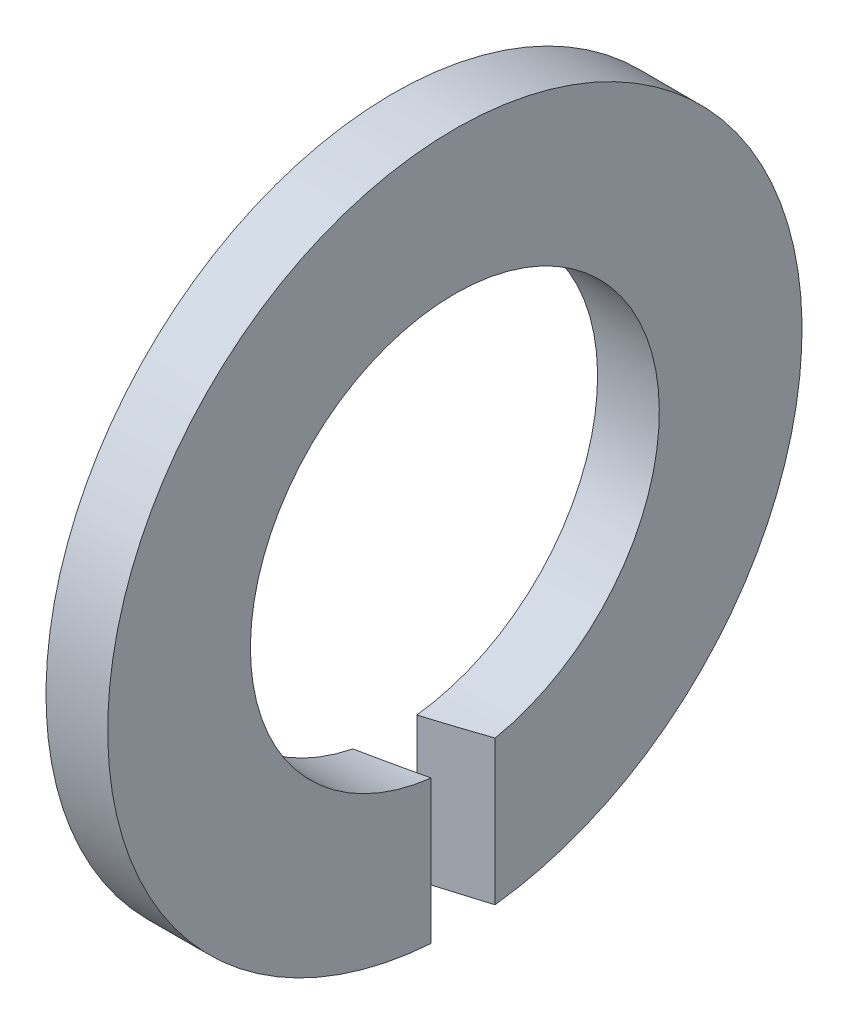
ISO-10303-21;
HEADER;
FILE_DESCRIPTION(('STEP AP214'),'2;1');
FILE_NAME('part.step','',(''),(''),'','','');
FILE_SCHEMA(('AUTOMOTIVE_DESIGN { 1 0 10303 214 1 1 1 1 }'));
ENDSEC;
DATA;
#1=APPLICATION_CONTEXT('core data for automotive mechanical design processes');
#2=APPLICATION_PROTOCOL_DEFINITION('international standard','automotive_design',2000,#1);
#3=PRODUCT_CONTEXT('',#1,'mechanical');
#4=PRODUCT('Part','Part','',(#3));
#5=PRODUCT_RELATED_PRODUCT_CATEGORY('part','',(#4));
#6=PRODUCT_DEFINITION_FORMATION('','',#4);
#7=PRODUCT_DEFINITION_CONTEXT('part definition',#1,'design');
#8=PRODUCT_DEFINITION('design','',#6,#7);
#9=PRODUCT_DEFINITION_SHAPE('','',#8);
#10=(LENGTH_UNIT() NAMED_UNIT(*) SI_UNIT(.MILLI.,.METRE.));
#11=(NAMED_UNIT(*) PLANE_ANGLE_UNIT() SI_UNIT($,.RADIAN.));
#12=(NAMED_UNIT(*) SI_UNIT($,.STERADIAN.) SOLID_ANGLE_UNIT());
#13=UNCERTAINTY_MEASURE_WITH_UNIT(LENGTH_MEASURE(1.E-05),#10,'distance_accuracy_value','');
#14=(GEOMETRIC_REPRESENTATION_CONTEXT(3) GLOBAL_UNCERTAINTY_ASSIGNED_CONTEXT((#13)) GLOBAL_UNIT_ASSIGNED_CONTEXT((#10,
#11,#12)) REPRESENTATION_CONTEXT('',''));
#15=CARTESIAN_POINT('',(0.,0.,0.));
#16=DIRECTION('',(0.,0.,1.));
#17=DIRECTION('',(1.,0.,0.));
#18=AXIS2_PLACEMENT_3D('',#15,#16,#17);
#19=CARTESIAN_POINT('',(-34.9249999999999,0.,0.));
#20=DIRECTION('',(-1.,0.,0.));
#21=DIRECTION('',(0.,0.,1.));
#22=AXIS2_PLACEMENT_3D('',#19,#20,#21);
#23=CYLINDRICAL_SURFACE('',#22,2.65);
#24=CARTESIAN_POINT('',(-0.800000000000002,0.,0.));
#25=DIRECTION('',(-1.,0.,0.));
#26=DIRECTION('',(0.,0.,1.));
#27=AXIS2_PLACEMENT_3D('',#24,#25,#26);
#28=CIRCLE('',#27,2.65);
#29=CARTESIAN_POINT('',(-0.800000000000002,-2.59822181124192,0.521290149136479));
#30=VERTEX_POINT('',#29);
#31=CARTESIAN_POINT('',(-0.800000000000002,-2.63216517091216,-0.306930795191587));
#32=VERTEX_POINT('',#31);
#33=EDGE_CURVE('E81',#30,#32,#28,.T.);
#34=ORIENTED_EDGE('',*,*,#33,.T.);
#35=CARTESIAN_POINT('',(-1.94548132206255,0.,0.));
#36=DIRECTION('',(-0.258819045102515,0.,-0.96592582628907));
#37=DIRECTION('',(-0.96592582628907,0.,0.258819045102515));
#38=AXIS2_PLACEMENT_3D('',#35,#36,#37);
#39=ELLIPSE('',#38,10.2388137586644,2.65);
#40=CARTESIAN_POINT('',(0.,-2.59822181124192,-0.521290149136479));
#41=VERTEX_POINT('',#40);
#42=EDGE_CURVE('E55',#32,#41,#39,.F.);
#43=ORIENTED_EDGE('',*,*,#42,.T.);
#44=CARTESIAN_POINT('',(0.,0.,0.));
#45=DIRECTION('',(-1.,0.,0.));
#46=DIRECTION('',(0.,0.,1.));
#47=AXIS2_PLACEMENT_3D('',#44,#45,#46);
#48=CIRCLE('',#47,2.65);
#49=CARTESIAN_POINT('',(0.,-2.63216517091216,0.306930795191586));
#50=VERTEX_POINT('',#49);
#51=EDGE_CURVE('E77',#50,#41,#48,.T.);
#52=ORIENTED_EDGE('',*,*,#51,.F.);
#53=CARTESIAN_POINT('',(1.14548132206254,0.,0.));
#54=DIRECTION('',(0.258819045102515,0.,0.96592582628907));
#55=DIRECTION('',(-0.96592582628907,0.,0.258819045102515));
#56=AXIS2_PLACEMENT_3D('',#53,#54,#55);
#57=ELLIPSE('',#56,10.2388137586644,2.65);
#58=EDGE_CURVE('E71',#50,#30,#57,.F.);
#59=ORIENTED_EDGE('',*,*,#58,.T.);
#60=EDGE_LOOP('',(#34,#43,#52,#59));
#61=FACE_BOUND('',#60,.T.);
#62=ADVANCED_FACE('F33',(#61),#23,.F.);
#63=CARTESIAN_POINT('',(0.,2.65,0.));
#64=DIRECTION('',(-1.,0.,0.));
#65=DIRECTION('',(0.,0.,1.));
#66=AXIS2_PLACEMENT_3D('',#63,#64,#65);
#67=PLANE('',#66);
#68=ORIENTED_EDGE('',*,*,#51,.T.);
#69=DIRECTION('',(0.,1.,0.));
#70=VECTOR('',#69,1.);
#71=CARTESIAN_POINT('',(0.,-10.,-0.521290149136479));
#72=LINE('',#71,#70);
#73=CARTESIAN_POINT('',(0.,-4.46970430570225,-0.521290149136479));
#74=VERTEX_POINT('',#73);
#75=EDGE_CURVE('E100',#74,#41,#72,.T.);
#76=ORIENTED_EDGE('',*,*,#75,.F.);
#77=CARTESIAN_POINT('',(0.,0.,0.));
#78=DIRECTION('',(-1.,0.,0.));
#79=DIRECTION('',(0.,0.,1.));
#80=AXIS2_PLACEMENT_3D('',#77,#78,#79);
#81=CIRCLE('',#80,4.5);
#82=CARTESIAN_POINT('',(0.,-4.48952040723317,0.306930795191585));
#83=VERTEX_POINT('',#82);
#84=EDGE_CURVE('E89',#83,#74,#81,.T.);
#85=ORIENTED_EDGE('',*,*,#84,.F.);
#86=DIRECTION('',(0.,1.,0.));
#87=VECTOR('',#86,1.);
#88=CARTESIAN_POINT('',(0.,2.65,0.306930795191586));
#89=LINE('',#88,#87);
#90=EDGE_CURVE('E84',#83,#50,#89,.T.);
#91=ORIENTED_EDGE('',*,*,#90,.T.);
#92=EDGE_LOOP('',(#68,#76,#85,#91));
#93=FACE_BOUND('',#92,.T.);
#94=ADVANCED_FACE('F98',(#93),#67,.F.);
#95=CARTESIAN_POINT('',(-34.9249999999999,0.,0.));
#96=DIRECTION('',(-1.,0.,0.));
#97=DIRECTION('',(0.,0.,1.));
#98=AXIS2_PLACEMENT_3D('',#95,#96,#97);
#99=CYLINDRICAL_SURFACE('',#98,4.5);
#100=ORIENTED_EDGE('',*,*,#84,.T.);
#101=CARTESIAN_POINT('',(-1.94548132206255,0.,0.));
#102=DIRECTION('',(-0.258819045102515,0.,-0.96592582628907));
#103=DIRECTION('',(-0.96592582628907,0.,0.258819045102515));
#104=AXIS2_PLACEMENT_3D('',#101,#102,#103);
#105=ELLIPSE('',#104,17.3866648732036,4.5);
#106=CARTESIAN_POINT('',(-0.800000000000002,-4.48952040723317,-0.306930795191587));
#107=VERTEX_POINT('',#106);
#108=EDGE_CURVE('E83',#74,#107,#105,.T.);
#109=ORIENTED_EDGE('',*,*,#108,.T.);
#110=CARTESIAN_POINT('',(-0.800000000000002,0.,0.));
#111=DIRECTION('',(-1.,0.,0.));
#112=DIRECTION('',(0.,0.,1.));
#113=AXIS2_PLACEMENT_3D('',#110,#111,#112);
#114=CIRCLE('',#113,4.5);
#115=CARTESIAN_POINT('',(-0.800000000000002,-4.46970430570225,0.521290149136479));
#116=VERTEX_POINT('',#115);
#117=EDGE_CURVE('E87',#116,#107,#114,.T.);
#118=ORIENTED_EDGE('',*,*,#117,.F.);
#119=CARTESIAN_POINT('',(1.14548132206254,0.,0.));
#120=DIRECTION('',(0.258819045102515,0.,0.96592582628907));
#121=DIRECTION('',(-0.96592582628907,0.,0.258819045102515));
#122=AXIS2_PLACEMENT_3D('',#119,#120,#121);
#123=ELLIPSE('',#122,17.3866648732036,4.5);
#124=EDGE_CURVE('E47',#116,#83,#123,.T.);
#125=ORIENTED_EDGE('',*,*,#124,.T.);
#126=EDGE_LOOP('',(#100,#109,#118,#125));
#127=FACE_BOUND('',#126,.T.);
#128=ADVANCED_FACE('F106',(#127),#99,.T.);
#129=CARTESIAN_POINT('',(-0.800000000000001,4.5,0.));
#130=DIRECTION('',(1.,0.,0.));
#131=DIRECTION('',(0.,0.,-1.));
#132=AXIS2_PLACEMENT_3D('',#129,#130,#131);
#133=PLANE('',#132);
#134=ORIENTED_EDGE('',*,*,#117,.T.);
#135=DIRECTION('',(0.,1.,0.));
#136=VECTOR('',#135,1.);
#137=CARTESIAN_POINT('',(-0.800000000000001,4.5,-0.306930795191587));
#138=LINE('',#137,#136);
#139=EDGE_CURVE('E11',#107,#32,#138,.T.);
#140=ORIENTED_EDGE('',*,*,#139,.T.);
#141=ORIENTED_EDGE('',*,*,#33,.F.);
#142=DIRECTION('',(0.,-1.,0.));
#143=VECTOR('',#142,1.);
#144=CARTESIAN_POINT('',(-0.800000000000001,4.5,0.521290149136479));
#145=LINE('',#144,#143);
#146=EDGE_CURVE('E40',#30,#116,#145,.T.);
#147=ORIENTED_EDGE('',*,*,#146,.T.);
#148=EDGE_LOOP('',(#134,#140,#141,#147));
#149=FACE_BOUND('',#148,.T.);
#150=ADVANCED_FACE('F86',(#149),#133,.F.);
#151=CARTESIAN_POINT('',(-0.800000000000002,-10.,0.521290149136479));
#152=DIRECTION('',(0.258819045102515,0.,0.96592582628907));
#153=DIRECTION('',(0.96592582628907,0.,-0.258819045102515));
#154=AXIS2_PLACEMENT_3D('',#151,#152,#153);
#155=PLANE('',#154);
#156=ORIENTED_EDGE('',*,*,#90,.F.);
#157=ORIENTED_EDGE('',*,*,#124,.F.);
#158=ORIENTED_EDGE('',*,*,#146,.F.);
#159=ORIENTED_EDGE('',*,*,#58,.F.);
#160=EDGE_LOOP('',(#156,#157,#158,#159));
#161=FACE_BOUND('',#160,.T.);
#162=ADVANCED_FACE('F70',(#161),#155,.F.);
#163=CARTESIAN_POINT('',(-1.00705523608201,-10.,-0.251450511894777));
#164=DIRECTION('',(-0.258819045102515,0.,-0.96592582628907));
#165=DIRECTION('',(-0.96592582628907,0.,0.258819045102515));
#166=AXIS2_PLACEMENT_3D('',#163,#164,#165);
#167=PLANE('',#166);
#168=ORIENTED_EDGE('',*,*,#139,.F.);
#169=ORIENTED_EDGE('',*,*,#108,.F.);
#170=ORIENTED_EDGE('',*,*,#75,.T.);
#171=ORIENTED_EDGE('',*,*,#42,.F.);
#172=EDGE_LOOP('',(#168,#169,#170,#171));
#173=FACE_BOUND('',#172,.T.);
#174=ADVANCED_FACE('F107',(#173),#167,.F.);
#175=CLOSED_SHELL('',(#62,#94,#128,#150,#162,#174));
#176=MANIFOLD_SOLID_BREP('B2',#175);
#177=ADVANCED_BREP_SHAPE_REPRESENTATION('',(#18,#176),#14);
#178=SHAPE_DEFINITION_REPRESENTATION(#9,#177);
ENDSEC;
END-ISO-10303-21;
